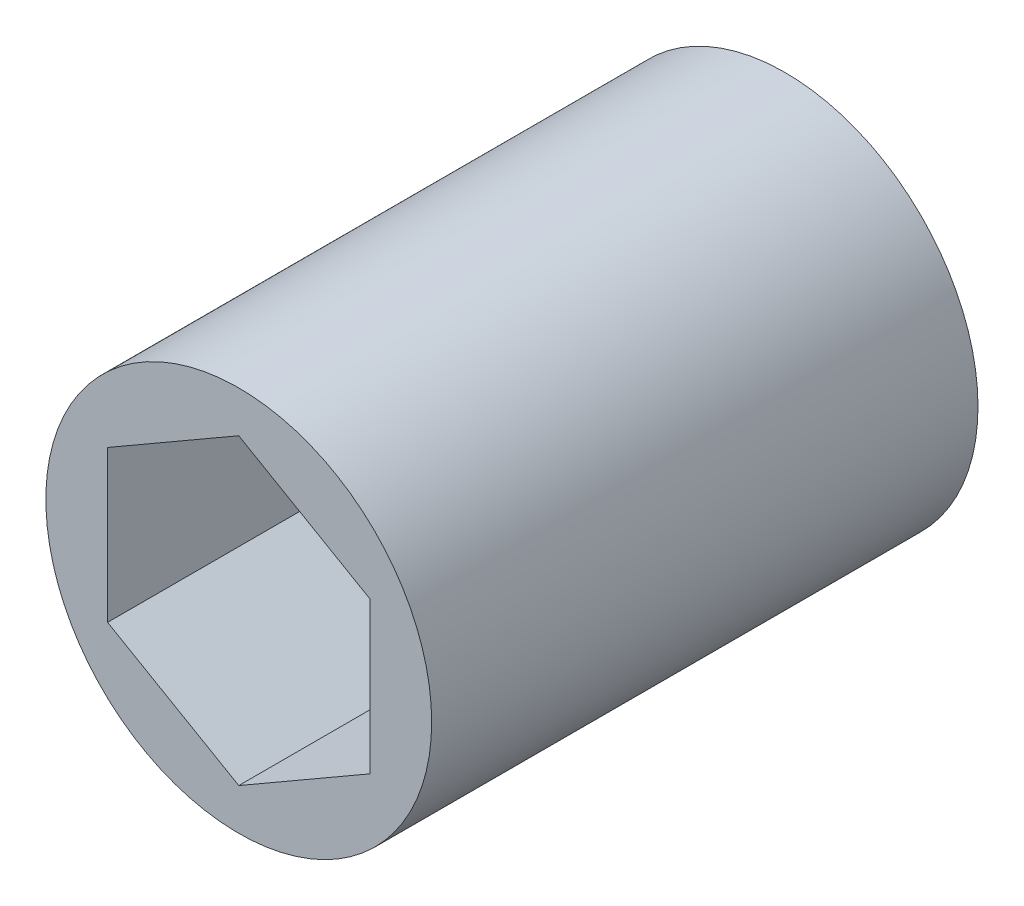
ISO-10303-21;
HEADER;
FILE_DESCRIPTION(('STEP AP214'),'2;1');
FILE_NAME('part.step','',(''),(''),'','','');
FILE_SCHEMA(('AUTOMOTIVE_DESIGN { 1 0 10303 214 1 1 1 1 }'));
ENDSEC;
DATA;
#1=APPLICATION_CONTEXT('core data for automotive mechanical design processes');
#2=APPLICATION_PROTOCOL_DEFINITION('international standard','automotive_design',2000,#1);
#3=PRODUCT_CONTEXT('',#1,'mechanical');
#4=PRODUCT('Part','Part','',(#3));
#5=PRODUCT_RELATED_PRODUCT_CATEGORY('part','',(#4));
#6=PRODUCT_DEFINITION_FORMATION('','',#4);
#7=PRODUCT_DEFINITION_CONTEXT('part definition',#1,'design');
#8=PRODUCT_DEFINITION('design','',#6,#7);
#9=PRODUCT_DEFINITION_SHAPE('','',#8);
#10=(LENGTH_UNIT() NAMED_UNIT(*) SI_UNIT(.MILLI.,.METRE.));
#11=(NAMED_UNIT(*) PLANE_ANGLE_UNIT() SI_UNIT($,.RADIAN.));
#12=(NAMED_UNIT(*) SI_UNIT($,.STERADIAN.) SOLID_ANGLE_UNIT());
#13=UNCERTAINTY_MEASURE_WITH_UNIT(LENGTH_MEASURE(1.E-05),#10,'distance_accuracy_value','');
#14=(GEOMETRIC_REPRESENTATION_CONTEXT(3) GLOBAL_UNCERTAINTY_ASSIGNED_CONTEXT((#13)) GLOBAL_UNIT_ASSIGNED_CONTEXT((#10,
#11,#12)) REPRESENTATION_CONTEXT('',''));
#15=CARTESIAN_POINT('',(0.,0.,0.));
#16=DIRECTION('',(0.,0.,1.));
#17=DIRECTION('',(1.,0.,0.));
#18=AXIS2_PLACEMENT_3D('',#15,#16,#17);
#19=CARTESIAN_POINT('',(0.,0.,13.4874));
#20=DIRECTION('',(0.,0.,1.));
#21=DIRECTION('',(1.,0.,0.));
#22=AXIS2_PLACEMENT_3D('',#19,#20,#21);
#23=PLANE('',#22);
#24=CARTESIAN_POINT('',(0.,0.,13.4874));
#25=DIRECTION('',(0.,0.,1.));
#26=DIRECTION('',(1.,0.,0.));
#27=AXIS2_PLACEMENT_3D('',#24,#25,#26);
#28=CIRCLE('',#27,9.525);
#29=CARTESIAN_POINT('',(9.525,0.,13.4874));
#30=VERTEX_POINT('',#29);
#31=EDGE_CURVE('E11',#30,#30,#28,.T.);
#32=ORIENTED_EDGE('',*,*,#31,.T.);
#33=EDGE_LOOP('',(#32));
#34=FACE_BOUND('',#33,.T.);
#35=DIRECTION('',(-0.866025403784438,-0.5,0.));
#36=VECTOR('',#35,1.);
#37=CARTESIAN_POINT('',(0.,7.47899538708241,13.4874));
#38=LINE('',#37,#36);
#39=CARTESIAN_POINT('',(0.,7.47899538708241,13.4874));
#40=VERTEX_POINT('',#39);
#41=CARTESIAN_POINT('',(-6.477,3.73949769354121,13.4874));
#42=VERTEX_POINT('',#41);
#43=EDGE_CURVE('E108',#40,#42,#38,.T.);
#44=ORIENTED_EDGE('',*,*,#43,.F.);
#45=DIRECTION('',(-0.866025403784439,0.5,0.));
#46=VECTOR('',#45,1.);
#47=CARTESIAN_POINT('',(6.477,3.73949769354121,13.4874));
#48=LINE('',#47,#46);
#49=CARTESIAN_POINT('',(6.477,3.73949769354121,13.4874));
#50=VERTEX_POINT('',#49);
#51=EDGE_CURVE('E99',#50,#40,#48,.T.);
#52=ORIENTED_EDGE('',*,*,#51,.F.);
#53=DIRECTION('',(0.,1.,0.));
#54=VECTOR('',#53,1.);
#55=CARTESIAN_POINT('',(6.477,-3.73949769354121,13.4874));
#56=LINE('',#55,#54);
#57=CARTESIAN_POINT('',(6.477,-3.73949769354121,13.4874));
#58=VERTEX_POINT('',#57);
#59=EDGE_CURVE('E133',#58,#50,#56,.T.);
#60=ORIENTED_EDGE('',*,*,#59,.F.);
#61=DIRECTION('',(0.866025403784439,0.5,0.));
#62=VECTOR('',#61,1.);
#63=CARTESIAN_POINT('',(0.,-7.47899538708241,13.4874));
#64=LINE('',#63,#62);
#65=CARTESIAN_POINT('',(0.,-7.47899538708241,13.4874));
#66=VERTEX_POINT('',#65);
#67=EDGE_CURVE('E130',#66,#58,#64,.T.);
#68=ORIENTED_EDGE('',*,*,#67,.F.);
#69=DIRECTION('',(0.866025403784439,-0.5,0.));
#70=VECTOR('',#69,1.);
#71=CARTESIAN_POINT('',(-6.477,-3.73949769354121,13.4874));
#72=LINE('',#71,#70);
#73=CARTESIAN_POINT('',(-6.477,-3.73949769354121,13.4874));
#74=VERTEX_POINT('',#73);
#75=EDGE_CURVE('E125',#74,#66,#72,.T.);
#76=ORIENTED_EDGE('',*,*,#75,.F.);
#77=DIRECTION('',(0.,-1.,0.));
#78=VECTOR('',#77,1.);
#79=CARTESIAN_POINT('',(-6.477,3.73949769354121,13.4874));
#80=LINE('',#79,#78);
#81=EDGE_CURVE('E121',#42,#74,#80,.T.);
#82=ORIENTED_EDGE('',*,*,#81,.F.);
#83=EDGE_LOOP('',(#44,#52,#60,#68,#76,#82));
#84=FACE_BOUND('',#83,.T.);
#85=ADVANCED_FACE('F45',(#34,#84),#23,.T.);
#86=CARTESIAN_POINT('',(0.,0.,-13.4874));
#87=DIRECTION('',(0.,0.,1.));
#88=DIRECTION('',(1.,0.,0.));
#89=AXIS2_PLACEMENT_3D('',#86,#87,#88);
#90=PLANE('',#89);
#91=CARTESIAN_POINT('',(0.,0.,-13.4874));
#92=DIRECTION('',(0.,0.,1.));
#93=DIRECTION('',(1.,0.,0.));
#94=AXIS2_PLACEMENT_3D('',#91,#92,#93);
#95=CIRCLE('',#94,9.525);
#96=CARTESIAN_POINT('',(9.525,0.,-13.4874));
#97=VERTEX_POINT('',#96);
#98=EDGE_CURVE('E49',#97,#97,#95,.T.);
#99=ORIENTED_EDGE('',*,*,#98,.F.);
#100=EDGE_LOOP('',(#99));
#101=FACE_BOUND('',#100,.T.);
#102=DIRECTION('',(-0.866025403784439,0.5,0.));
#103=VECTOR('',#102,1.);
#104=CARTESIAN_POINT('',(6.477,3.73949769354121,-13.4874));
#105=LINE('',#104,#103);
#106=CARTESIAN_POINT('',(6.477,3.73949769354121,-13.4874));
#107=VERTEX_POINT('',#106);
#108=CARTESIAN_POINT('',(0.,7.47899538708241,-13.4874));
#109=VERTEX_POINT('',#108);
#110=EDGE_CURVE('E69',#107,#109,#105,.T.);
#111=ORIENTED_EDGE('',*,*,#110,.T.);
#112=DIRECTION('',(-0.866025403784438,-0.5,0.));
#113=VECTOR('',#112,1.);
#114=CARTESIAN_POINT('',(0.,7.47899538708241,-13.4874));
#115=LINE('',#114,#113);
#116=CARTESIAN_POINT('',(-6.477,3.73949769354121,-13.4874));
#117=VERTEX_POINT('',#116);
#118=EDGE_CURVE('E115',#109,#117,#115,.T.);
#119=ORIENTED_EDGE('',*,*,#118,.T.);
#120=DIRECTION('',(0.,-1.,0.));
#121=VECTOR('',#120,1.);
#122=CARTESIAN_POINT('',(-6.477,3.73949769354121,-13.4874));
#123=LINE('',#122,#121);
#124=CARTESIAN_POINT('',(-6.477,-3.73949769354121,-13.4874));
#125=VERTEX_POINT('',#124);
#126=EDGE_CURVE('E140',#117,#125,#123,.T.);
#127=ORIENTED_EDGE('',*,*,#126,.T.);
#128=DIRECTION('',(0.866025403784439,-0.5,0.));
#129=VECTOR('',#128,1.);
#130=CARTESIAN_POINT('',(-6.477,-3.73949769354121,-13.4874));
#131=LINE('',#130,#129);
#132=CARTESIAN_POINT('',(0.,-7.47899538708241,-13.4874));
#133=VERTEX_POINT('',#132);
#134=EDGE_CURVE('E144',#125,#133,#131,.T.);
#135=ORIENTED_EDGE('',*,*,#134,.T.);
#136=DIRECTION('',(0.866025403784439,0.5,0.));
#137=VECTOR('',#136,1.);
#138=CARTESIAN_POINT('',(0.,-7.47899538708241,-13.4874));
#139=LINE('',#138,#137);
#140=CARTESIAN_POINT('',(6.477,-3.73949769354121,-13.4874));
#141=VERTEX_POINT('',#140);
#142=EDGE_CURVE('E148',#133,#141,#139,.T.);
#143=ORIENTED_EDGE('',*,*,#142,.T.);
#144=DIRECTION('',(0.,1.,0.));
#145=VECTOR('',#144,1.);
#146=CARTESIAN_POINT('',(6.477,-3.73949769354121,-13.4874));
#147=LINE('',#146,#145);
#148=EDGE_CURVE('E109',#141,#107,#147,.T.);
#149=ORIENTED_EDGE('',*,*,#148,.T.);
#150=EDGE_LOOP('',(#111,#119,#127,#135,#143,#149));
#151=FACE_BOUND('',#150,.T.);
#152=ADVANCED_FACE('F172',(#101,#151),#90,.F.);
#153=CARTESIAN_POINT('',(0.,0.,13.4874));
#154=DIRECTION('',(0.,0.,-1.));
#155=DIRECTION('',(-1.,0.,0.));
#156=AXIS2_PLACEMENT_3D('',#153,#154,#155);
#157=CYLINDRICAL_SURFACE('',#156,9.525);
#158=ORIENTED_EDGE('',*,*,#31,.F.);
#159=EDGE_LOOP('',(#158));
#160=FACE_BOUND('',#159,.T.);
#161=ORIENTED_EDGE('',*,*,#98,.T.);
#162=EDGE_LOOP('',(#161));
#163=FACE_BOUND('',#162,.T.);
#164=ADVANCED_FACE('F47',(#160,#163),#157,.T.);
#165=CARTESIAN_POINT('',(6.477,3.73949769354121,13.4874));
#166=DIRECTION('',(-0.5,-0.866025403784439,0.));
#167=DIRECTION('',(0.866025403784439,-0.5,0.));
#168=AXIS2_PLACEMENT_3D('',#165,#166,#167);
#169=PLANE('',#168);
#170=ORIENTED_EDGE('',*,*,#110,.F.);
#171=DIRECTION('',(0.,0.,-1.));
#172=VECTOR('',#171,1.);
#173=CARTESIAN_POINT('',(6.477,3.73949769354121,13.4874));
#174=LINE('',#173,#172);
#175=EDGE_CURVE('E103',#50,#107,#174,.T.);
#176=ORIENTED_EDGE('',*,*,#175,.F.);
#177=ORIENTED_EDGE('',*,*,#51,.T.);
#178=DIRECTION('',(0.,0.,-1.));
#179=VECTOR('',#178,1.);
#180=CARTESIAN_POINT('',(0.,7.47899538708241,13.4874));
#181=LINE('',#180,#179);
#182=EDGE_CURVE('E102',#40,#109,#181,.T.);
#183=ORIENTED_EDGE('',*,*,#182,.T.);
#184=EDGE_LOOP('',(#170,#176,#177,#183));
#185=FACE_BOUND('',#184,.T.);
#186=ADVANCED_FACE('F101',(#185),#169,.T.);
#187=CARTESIAN_POINT('',(0.,7.47899538708241,13.4874));
#188=DIRECTION('',(0.5,-0.866025403784439,0.));
#189=DIRECTION('',(0.866025403784439,0.5,0.));
#190=AXIS2_PLACEMENT_3D('',#187,#188,#189);
#191=PLANE('',#190);
#192=ORIENTED_EDGE('',*,*,#118,.F.);
#193=ORIENTED_EDGE('',*,*,#182,.F.);
#194=ORIENTED_EDGE('',*,*,#43,.T.);
#195=DIRECTION('',(0.,0.,-1.));
#196=VECTOR('',#195,1.);
#197=CARTESIAN_POINT('',(-6.477,3.73949769354121,13.4874));
#198=LINE('',#197,#196);
#199=EDGE_CURVE('E117',#42,#117,#198,.T.);
#200=ORIENTED_EDGE('',*,*,#199,.T.);
#201=EDGE_LOOP('',(#192,#193,#194,#200));
#202=FACE_BOUND('',#201,.T.);
#203=ADVANCED_FACE('F112',(#202),#191,.T.);
#204=CARTESIAN_POINT('',(-6.477,3.73949769354121,13.4874));
#205=DIRECTION('',(1.,0.,0.));
#206=DIRECTION('',(0.,1.,0.));
#207=AXIS2_PLACEMENT_3D('',#204,#205,#206);
#208=PLANE('',#207);
#209=ORIENTED_EDGE('',*,*,#126,.F.);
#210=ORIENTED_EDGE('',*,*,#199,.F.);
#211=ORIENTED_EDGE('',*,*,#81,.T.);
#212=DIRECTION('',(0.,0.,-1.));
#213=VECTOR('',#212,1.);
#214=CARTESIAN_POINT('',(-6.477,-3.73949769354121,13.4874));
#215=LINE('',#214,#213);
#216=EDGE_CURVE('E162',#74,#125,#215,.T.);
#217=ORIENTED_EDGE('',*,*,#216,.T.);
#218=EDGE_LOOP('',(#209,#210,#211,#217));
#219=FACE_BOUND('',#218,.T.);
#220=ADVANCED_FACE('F168',(#219),#208,.T.);
#221=CARTESIAN_POINT('',(-6.477,-3.73949769354121,13.4874));
#222=DIRECTION('',(0.5,0.866025403784439,0.));
#223=DIRECTION('',(-0.866025403784439,0.5,0.));
#224=AXIS2_PLACEMENT_3D('',#221,#222,#223);
#225=PLANE('',#224);
#226=ORIENTED_EDGE('',*,*,#134,.F.);
#227=ORIENTED_EDGE('',*,*,#216,.F.);
#228=ORIENTED_EDGE('',*,*,#75,.T.);
#229=DIRECTION('',(0.,0.,-1.));
#230=VECTOR('',#229,1.);
#231=CARTESIAN_POINT('',(0.,-7.47899538708241,13.4874));
#232=LINE('',#231,#230);
#233=EDGE_CURVE('E159',#66,#133,#232,.T.);
#234=ORIENTED_EDGE('',*,*,#233,.T.);
#235=EDGE_LOOP('',(#226,#227,#228,#234));
#236=FACE_BOUND('',#235,.T.);
#237=ADVANCED_FACE('F180',(#236),#225,.T.);
#238=CARTESIAN_POINT('',(0.,-7.47899538708241,13.4874));
#239=DIRECTION('',(-0.5,0.866025403784439,0.));
#240=DIRECTION('',(-0.866025403784439,-0.5,0.));
#241=AXIS2_PLACEMENT_3D('',#238,#239,#240);
#242=PLANE('',#241);
#243=ORIENTED_EDGE('',*,*,#142,.F.);
#244=ORIENTED_EDGE('',*,*,#233,.F.);
#245=ORIENTED_EDGE('',*,*,#67,.T.);
#246=DIRECTION('',(0.,0.,-1.));
#247=VECTOR('',#246,1.);
#248=CARTESIAN_POINT('',(6.477,-3.73949769354121,13.4874));
#249=LINE('',#248,#247);
#250=EDGE_CURVE('E61',#58,#141,#249,.T.);
#251=ORIENTED_EDGE('',*,*,#250,.T.);
#252=EDGE_LOOP('',(#243,#244,#245,#251));
#253=FACE_BOUND('',#252,.T.);
#254=ADVANCED_FACE('F178',(#253),#242,.T.);
#255=CARTESIAN_POINT('',(6.477,-3.73949769354121,13.4874));
#256=DIRECTION('',(-1.,0.,0.));
#257=DIRECTION('',(0.,-1.,0.));
#258=AXIS2_PLACEMENT_3D('',#255,#256,#257);
#259=PLANE('',#258);
#260=ORIENTED_EDGE('',*,*,#148,.F.);
#261=ORIENTED_EDGE('',*,*,#250,.F.);
#262=ORIENTED_EDGE('',*,*,#59,.T.);
#263=ORIENTED_EDGE('',*,*,#175,.T.);
#264=EDGE_LOOP('',(#260,#261,#262,#263));
#265=FACE_BOUND('',#264,.T.);
#266=ADVANCED_FACE('F174',(#265),#259,.T.);
#267=CLOSED_SHELL('',(#85,#152,#164,#186,#203,#220,#237,#254,#266));
#268=MANIFOLD_SOLID_BREP('B2',#267);
#269=ADVANCED_BREP_SHAPE_REPRESENTATION('',(#18,#268),#14);
#270=SHAPE_DEFINITION_REPRESENTATION(#9,#269);
ENDSEC;
END-ISO-10303-21;
